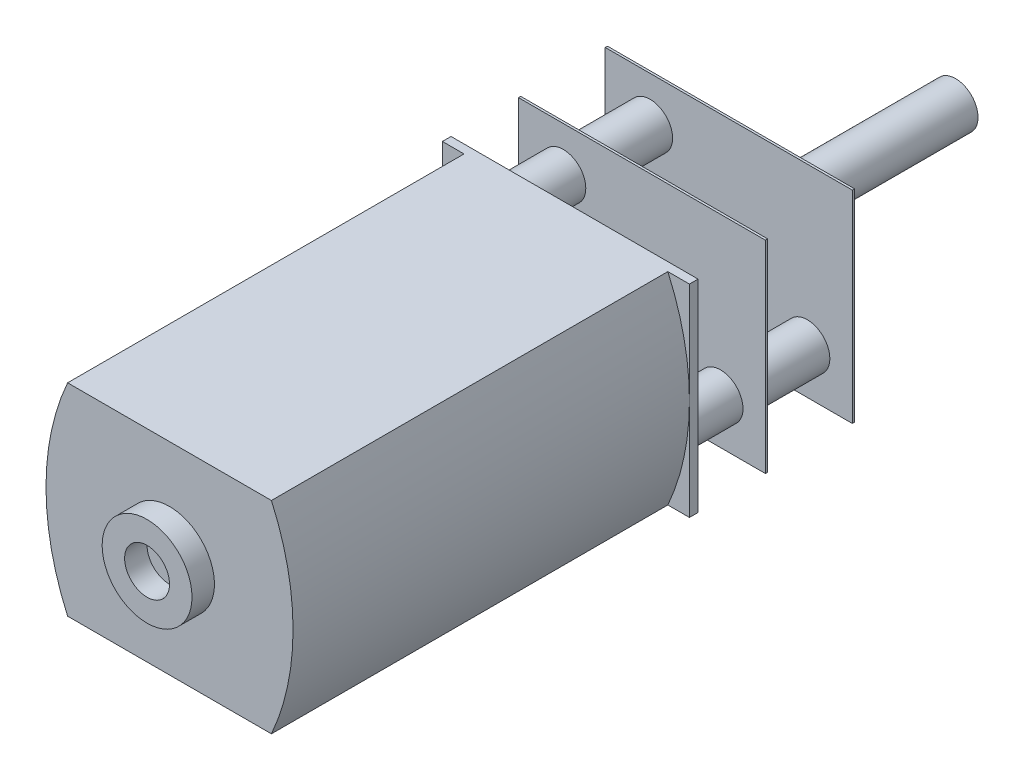
ISO-10303-21;
HEADER;
FILE_DESCRIPTION(('STEP AP214'),'2;1');
FILE_NAME('part.step','',(''),(''),'','','');
FILE_SCHEMA(('AUTOMOTIVE_DESIGN { 1 0 10303 214 1 1 1 1 }'));
ENDSEC;
DATA;
#1=APPLICATION_CONTEXT('core data for automotive mechanical design processes');
#2=APPLICATION_PROTOCOL_DEFINITION('international standard','automotive_design',2000,#1);
#3=PRODUCT_CONTEXT('',#1,'mechanical');
#4=PRODUCT('Part','Part','',(#3));
#5=PRODUCT_RELATED_PRODUCT_CATEGORY('part','',(#4));
#6=PRODUCT_DEFINITION_FORMATION('','',#4);
#7=PRODUCT_DEFINITION_CONTEXT('part definition',#1,'design');
#8=PRODUCT_DEFINITION('design','',#6,#7);
#9=PRODUCT_DEFINITION_SHAPE('','',#8);
#10=(LENGTH_UNIT() NAMED_UNIT(*) SI_UNIT(.MILLI.,.METRE.));
#11=(NAMED_UNIT(*) PLANE_ANGLE_UNIT() SI_UNIT($,.RADIAN.));
#12=(NAMED_UNIT(*) SI_UNIT($,.STERADIAN.) SOLID_ANGLE_UNIT());
#13=UNCERTAINTY_MEASURE_WITH_UNIT(LENGTH_MEASURE(1.E-05),#10,'distance_accuracy_value','');
#14=(GEOMETRIC_REPRESENTATION_CONTEXT(3) GLOBAL_UNCERTAINTY_ASSIGNED_CONTEXT((#13)) GLOBAL_UNIT_ASSIGNED_CONTEXT((#10,
#11,#12)) REPRESENTATION_CONTEXT('',''));
#15=CARTESIAN_POINT('',(0.,0.,0.));
#16=DIRECTION('',(0.,0.,1.));
#17=DIRECTION('',(1.,0.,0.));
#18=AXIS2_PLACEMENT_3D('',#15,#16,#17);
#19=CARTESIAN_POINT('',(2.,7.,-25.));
#20=DIRECTION('',(0.,0.,-1.));
#21=DIRECTION('',(-1.,0.,0.));
#22=AXIS2_PLACEMENT_3D('',#19,#20,#21);
#23=PLANE('',#22);
#24=DIRECTION('',(-1.,0.,0.));
#25=VECTOR('',#24,1.);
#26=CARTESIAN_POINT('',(0.,0.,-25.));
#27=LINE('',#26,#25);
#28=CARTESIAN_POINT('',(11.,0.,-25.));
#29=VERTEX_POINT('',#28);
#30=CARTESIAN_POINT('',(0.,0.,-25.));
#31=VERTEX_POINT('',#30);
#32=EDGE_CURVE('E242',#29,#31,#27,.T.);
#33=ORIENTED_EDGE('',*,*,#32,.T.);
#34=DIRECTION('',(0.,-1.,0.));
#35=VECTOR('',#34,1.);
#36=CARTESIAN_POINT('',(0.,9.,-25.));
#37=LINE('',#36,#35);
#38=CARTESIAN_POINT('',(0.,9.,-25.));
#39=VERTEX_POINT('',#38);
#40=EDGE_CURVE('E245',#39,#31,#37,.T.);
#41=ORIENTED_EDGE('',*,*,#40,.F.);
#42=DIRECTION('',(-1.,0.,0.));
#43=VECTOR('',#42,1.);
#44=CARTESIAN_POINT('',(0.,9.,-25.));
#45=LINE('',#44,#43);
#46=CARTESIAN_POINT('',(11.,9.,-25.));
#47=VERTEX_POINT('',#46);
#48=EDGE_CURVE('E238',#47,#39,#45,.T.);
#49=ORIENTED_EDGE('',*,*,#48,.F.);
#50=DIRECTION('',(0.,-1.,0.));
#51=VECTOR('',#50,1.);
#52=CARTESIAN_POINT('',(11.,9.,-25.));
#53=LINE('',#52,#51);
#54=EDGE_CURVE('E244',#47,#29,#53,.T.);
#55=ORIENTED_EDGE('',*,*,#54,.T.);
#56=EDGE_LOOP('',(#33,#41,#49,#55));
#57=FACE_BOUND('',#56,.T.);
#58=CARTESIAN_POINT('',(5.5,4.5,-25.));
#59=DIRECTION('',(0.,0.,-1.));
#60=DIRECTION('',(-1.,0.,0.));
#61=AXIS2_PLACEMENT_3D('',#58,#59,#60);
#62=CIRCLE('',#61,1.);
#63=CARTESIAN_POINT('',(4.5,4.5,-25.));
#64=VERTEX_POINT('',#63);
#65=EDGE_CURVE('E701',#64,#64,#62,.T.);
#66=ORIENTED_EDGE('',*,*,#65,.F.);
#67=EDGE_LOOP('',(#66));
#68=FACE_BOUND('',#67,.T.);
#69=ADVANCED_FACE('F70',(#57,#68),#23,.T.);
#70=CARTESIAN_POINT('',(0.,9.,0.));
#71=DIRECTION('',(0.,0.,-1.));
#72=DIRECTION('',(-1.,0.,0.));
#73=AXIS2_PLACEMENT_3D('',#70,#71,#72);
#74=PLANE('',#73);
#75=DIRECTION('',(1.,0.,0.));
#76=VECTOR('',#75,1.);
#77=CARTESIAN_POINT('',(0.,9.,0.));
#78=LINE('',#77,#76);
#79=CARTESIAN_POINT('',(0.962570050057635,9.,0.));
#80=VERTEX_POINT('',#79);
#81=CARTESIAN_POINT('',(10.0374299499424,9.,0.));
#82=VERTEX_POINT('',#81);
#83=EDGE_CURVE('E207',#80,#82,#78,.T.);
#84=ORIENTED_EDGE('',*,*,#83,.F.);
#85=CARTESIAN_POINT('',(11.,4.5,0.));
#86=DIRECTION('',(0.,0.,1.));
#87=DIRECTION('',(1.,0.,0.));
#88=AXIS2_PLACEMENT_3D('',#85,#86,#87);
#89=CIRCLE('',#88,11.);
#90=CARTESIAN_POINT('',(0.962570050057635,0.,0.));
#91=VERTEX_POINT('',#90);
#92=EDGE_CURVE('E189',#80,#91,#89,.T.);
#93=ORIENTED_EDGE('',*,*,#92,.T.);
#94=DIRECTION('',(1.,0.,0.));
#95=VECTOR('',#94,1.);
#96=CARTESIAN_POINT('',(0.,0.,0.));
#97=LINE('',#96,#95);
#98=CARTESIAN_POINT('',(10.0374299499424,0.,0.));
#99=VERTEX_POINT('',#98);
#100=EDGE_CURVE('E231',#91,#99,#97,.T.);
#101=ORIENTED_EDGE('',*,*,#100,.T.);
#102=CARTESIAN_POINT('',(0.,4.5,0.));
#103=DIRECTION('',(0.,0.,1.));
#104=DIRECTION('',(1.,0.,0.));
#105=AXIS2_PLACEMENT_3D('',#102,#103,#104);
#106=CIRCLE('',#105,11.);
#107=EDGE_CURVE('E218',#99,#82,#106,.T.);
#108=ORIENTED_EDGE('',*,*,#107,.T.);
#109=EDGE_LOOP('',(#84,#93,#101,#108));
#110=FACE_BOUND('',#109,.T.);
#111=CARTESIAN_POINT('',(5.5,4.5,0.));
#112=DIRECTION('',(0.,0.,-1.));
#113=DIRECTION('',(-1.,0.,0.));
#114=AXIS2_PLACEMENT_3D('',#111,#112,#113);
#115=CIRCLE('',#114,2.);
#116=CARTESIAN_POINT('',(3.5,4.5,0.));
#117=VERTEX_POINT('',#116);
#118=EDGE_CURVE('E12',#117,#117,#115,.F.);
#119=ORIENTED_EDGE('',*,*,#118,.F.);
#120=EDGE_LOOP('',(#119));
#121=FACE_BOUND('',#120,.T.);
#122=ADVANCED_FACE('F215',(#110,#121),#74,.F.);
#123=CARTESIAN_POINT('',(2.,7.,-15.2059029062643));
#124=DIRECTION('',(0.,0.,-1.));
#125=DIRECTION('',(-1.,0.,0.));
#126=AXIS2_PLACEMENT_3D('',#123,#124,#125);
#127=CYLINDRICAL_SURFACE('',#126,1.);
#128=CARTESIAN_POINT('',(2.,7.,-21.1343300310105));
#129=DIRECTION('',(0.,0.,1.));
#130=DIRECTION('',(1.,0.,0.));
#131=AXIS2_PLACEMENT_3D('',#128,#129,#130);
#132=CIRCLE('',#131,1.);
#133=CARTESIAN_POINT('',(3.,7.,-21.1343300310105));
#134=VERTEX_POINT('',#133);
#135=EDGE_CURVE('E276',#134,#134,#132,.T.);
#136=ORIENTED_EDGE('',*,*,#135,.F.);
#137=EDGE_LOOP('',(#136));
#138=FACE_BOUND('',#137,.T.);
#139=CARTESIAN_POINT('',(2.,7.,-24.9));
#140=DIRECTION('',(0.,0.,-1.));
#141=DIRECTION('',(-1.,0.,0.));
#142=AXIS2_PLACEMENT_3D('',#139,#140,#141);
#143=CIRCLE('',#142,1.);
#144=CARTESIAN_POINT('',(0.999999999999999,7.,-24.9));
#145=VERTEX_POINT('',#144);
#146=EDGE_CURVE('E255',#145,#145,#143,.F.);
#147=ORIENTED_EDGE('',*,*,#146,.T.);
#148=EDGE_LOOP('',(#147));
#149=FACE_BOUND('',#148,.T.);
#150=ADVANCED_FACE('F301',(#138,#149),#127,.T.);
#151=CARTESIAN_POINT('',(0.,0.,-21.0343300310105));
#152=DIRECTION('',(0.,0.,1.));
#153=DIRECTION('',(1.,0.,0.));
#154=AXIS2_PLACEMENT_3D('',#151,#152,#153);
#155=PLANE('',#154);
#156=CARTESIAN_POINT('',(9.,2.,-21.0343300310105));
#157=DIRECTION('',(0.,0.,1.));
#158=DIRECTION('',(1.,0.,0.));
#159=AXIS2_PLACEMENT_3D('',#156,#157,#158);
#160=CIRCLE('',#159,1.);
#161=CARTESIAN_POINT('',(10.,2.,-21.0343300310105));
#162=VERTEX_POINT('',#161);
#163=EDGE_CURVE('E78',#162,#162,#160,.T.);
#164=ORIENTED_EDGE('',*,*,#163,.F.);
#165=EDGE_LOOP('',(#164));
#166=FACE_BOUND('',#165,.T.);
#167=CARTESIAN_POINT('',(2.,7.,-21.0343300310105));
#168=DIRECTION('',(0.,0.,1.));
#169=DIRECTION('',(1.,0.,0.));
#170=AXIS2_PLACEMENT_3D('',#167,#168,#169);
#171=CIRCLE('',#170,1.);
#172=CARTESIAN_POINT('',(3.,7.,-21.0343300310105));
#173=VERTEX_POINT('',#172);
#174=EDGE_CURVE('E268',#173,#173,#171,.T.);
#175=ORIENTED_EDGE('',*,*,#174,.F.);
#176=EDGE_LOOP('',(#175));
#177=FACE_BOUND('',#176,.T.);
#178=DIRECTION('',(1.,0.,0.));
#179=VECTOR('',#178,1.);
#180=CARTESIAN_POINT('',(0.,9.,-21.0343300310105));
#181=LINE('',#180,#179);
#182=CARTESIAN_POINT('',(0.,9.,-21.0343300310105));
#183=VERTEX_POINT('',#182);
#184=CARTESIAN_POINT('',(11.,9.,-21.0343300310105));
#185=VERTEX_POINT('',#184);
#186=EDGE_CURVE('E285',#183,#185,#181,.T.);
#187=ORIENTED_EDGE('',*,*,#186,.F.);
#188=DIRECTION('',(0.,1.,0.));
#189=VECTOR('',#188,1.);
#190=CARTESIAN_POINT('',(0.,0.,-21.0343300310105));
#191=LINE('',#190,#189);
#192=CARTESIAN_POINT('',(0.,0.,-21.0343300310105));
#193=VERTEX_POINT('',#192);
#194=EDGE_CURVE('E278',#193,#183,#191,.T.);
#195=ORIENTED_EDGE('',*,*,#194,.F.);
#196=DIRECTION('',(1.,0.,0.));
#197=VECTOR('',#196,1.);
#198=CARTESIAN_POINT('',(0.,0.,-21.0343300310105));
#199=LINE('',#198,#197);
#200=CARTESIAN_POINT('',(11.,0.,-21.0343300310105));
#201=VERTEX_POINT('',#200);
#202=EDGE_CURVE('E281',#193,#201,#199,.T.);
#203=ORIENTED_EDGE('',*,*,#202,.T.);
#204=DIRECTION('',(0.,1.,0.));
#205=VECTOR('',#204,1.);
#206=CARTESIAN_POINT('',(11.,0.,-21.0343300310105));
#207=LINE('',#206,#205);
#208=EDGE_CURVE('E94',#201,#185,#207,.T.);
#209=ORIENTED_EDGE('',*,*,#208,.T.);
#210=EDGE_LOOP('',(#187,#195,#203,#209));
#211=FACE_BOUND('',#210,.T.);
#212=ADVANCED_FACE('F353',(#166,#177,#211),#155,.T.);
#213=CARTESIAN_POINT('',(0.,9.,0.));
#214=DIRECTION('',(0.,-1.,0.));
#215=DIRECTION('',(0.,0.,-1.));
#216=AXIS2_PLACEMENT_3D('',#213,#214,#215);
#217=PLANE('',#216);
#218=DIRECTION('',(0.,0.,-1.));
#219=VECTOR('',#218,1.);
#220=CARTESIAN_POINT('',(11.,9.,0.));
#221=LINE('',#220,#219);
#222=CARTESIAN_POINT('',(11.,9.,-21.1343300310105));
#223=VERTEX_POINT('',#222);
#224=EDGE_CURVE('E287',#185,#223,#221,.T.);
#225=ORIENTED_EDGE('',*,*,#224,.T.);
#226=DIRECTION('',(1.,0.,0.));
#227=VECTOR('',#226,1.);
#228=CARTESIAN_POINT('',(0.,9.,-21.1343300310105));
#229=LINE('',#228,#227);
#230=CARTESIAN_POINT('',(0.,9.,-21.1343300310105));
#231=VERTEX_POINT('',#230);
#232=EDGE_CURVE('E274',#231,#223,#229,.T.);
#233=ORIENTED_EDGE('',*,*,#232,.F.);
#234=DIRECTION('',(0.,0.,1.));
#235=VECTOR('',#234,1.);
#236=CARTESIAN_POINT('',(0.,9.,0.));
#237=LINE('',#236,#235);
#238=EDGE_CURVE('E290',#231,#183,#237,.T.);
#239=ORIENTED_EDGE('',*,*,#238,.T.);
#240=ORIENTED_EDGE('',*,*,#186,.T.);
#241=EDGE_LOOP('',(#225,#233,#239,#240));
#242=FACE_BOUND('',#241,.T.);
#243=ADVANCED_FACE('F356',(#242),#217,.F.);
#244=CARTESIAN_POINT('',(0.,0.,0.));
#245=DIRECTION('',(0.,-1.,0.));
#246=DIRECTION('',(0.,0.,-1.));
#247=AXIS2_PLACEMENT_3D('',#244,#245,#246);
#248=PLANE('',#247);
#249=DIRECTION('',(1.,0.,0.));
#250=VECTOR('',#249,1.);
#251=CARTESIAN_POINT('',(0.,0.,-21.1343300310105));
#252=LINE('',#251,#250);
#253=CARTESIAN_POINT('',(0.,0.,-21.1343300310105));
#254=VERTEX_POINT('',#253);
#255=CARTESIAN_POINT('',(11.,0.,-21.1343300310105));
#256=VERTEX_POINT('',#255);
#257=EDGE_CURVE('E271',#254,#256,#252,.T.);
#258=ORIENTED_EDGE('',*,*,#257,.T.);
#259=DIRECTION('',(0.,0.,-1.));
#260=VECTOR('',#259,1.);
#261=CARTESIAN_POINT('',(11.,0.,0.));
#262=LINE('',#261,#260);
#263=EDGE_CURVE('E288',#201,#256,#262,.T.);
#264=ORIENTED_EDGE('',*,*,#263,.F.);
#265=ORIENTED_EDGE('',*,*,#202,.F.);
#266=DIRECTION('',(0.,0.,1.));
#267=VECTOR('',#266,1.);
#268=CARTESIAN_POINT('',(0.,0.,0.));
#269=LINE('',#268,#267);
#270=EDGE_CURVE('E284',#254,#193,#269,.T.);
#271=ORIENTED_EDGE('',*,*,#270,.F.);
#272=EDGE_LOOP('',(#258,#264,#265,#271));
#273=FACE_BOUND('',#272,.T.);
#274=ADVANCED_FACE('F360',(#273),#248,.T.);
#275=CARTESIAN_POINT('',(11.,9.,0.));
#276=DIRECTION('',(-1.,0.,0.));
#277=DIRECTION('',(0.,0.,1.));
#278=AXIS2_PLACEMENT_3D('',#275,#276,#277);
#279=PLANE('',#278);
#280=ORIENTED_EDGE('',*,*,#263,.T.);
#281=DIRECTION('',(0.,1.,0.));
#282=VECTOR('',#281,1.);
#283=CARTESIAN_POINT('',(11.,0.,-21.1343300310105));
#284=LINE('',#283,#282);
#285=EDGE_CURVE('E85',#256,#223,#284,.T.);
#286=ORIENTED_EDGE('',*,*,#285,.T.);
#287=ORIENTED_EDGE('',*,*,#224,.F.);
#288=ORIENTED_EDGE('',*,*,#208,.F.);
#289=EDGE_LOOP('',(#280,#286,#287,#288));
#290=FACE_BOUND('',#289,.T.);
#291=ADVANCED_FACE('F363',(#290),#279,.F.);
#292=CARTESIAN_POINT('',(0.,9.,0.));
#293=DIRECTION('',(1.,0.,0.));
#294=DIRECTION('',(0.,0.,-1.));
#295=AXIS2_PLACEMENT_3D('',#292,#293,#294);
#296=PLANE('',#295);
#297=ORIENTED_EDGE('',*,*,#238,.F.);
#298=DIRECTION('',(0.,1.,0.));
#299=VECTOR('',#298,1.);
#300=CARTESIAN_POINT('',(0.,0.,-21.1343300310105));
#301=LINE('',#300,#299);
#302=EDGE_CURVE('E273',#254,#231,#301,.T.);
#303=ORIENTED_EDGE('',*,*,#302,.F.);
#304=ORIENTED_EDGE('',*,*,#270,.T.);
#305=ORIENTED_EDGE('',*,*,#194,.T.);
#306=EDGE_LOOP('',(#297,#303,#304,#305));
#307=FACE_BOUND('',#306,.T.);
#308=ADVANCED_FACE('F72',(#307),#296,.F.);
#309=CARTESIAN_POINT('',(0.,0.,-21.1343300310105));
#310=DIRECTION('',(0.,0.,1.));
#311=DIRECTION('',(1.,0.,0.));
#312=AXIS2_PLACEMENT_3D('',#309,#310,#311);
#313=PLANE('',#312);
#314=CARTESIAN_POINT('',(9.,2.,-21.1343300310105));
#315=DIRECTION('',(0.,0.,1.));
#316=DIRECTION('',(1.,0.,0.));
#317=AXIS2_PLACEMENT_3D('',#314,#315,#316);
#318=CIRCLE('',#317,1.);
#319=CARTESIAN_POINT('',(10.,2.,-21.1343300310105));
#320=VERTEX_POINT('',#319);
#321=EDGE_CURVE('E212',#320,#320,#318,.T.);
#322=ORIENTED_EDGE('',*,*,#321,.T.);
#323=EDGE_LOOP('',(#322));
#324=FACE_BOUND('',#323,.T.);
#325=ORIENTED_EDGE('',*,*,#135,.T.);
#326=EDGE_LOOP('',(#325));
#327=FACE_BOUND('',#326,.T.);
#328=ORIENTED_EDGE('',*,*,#232,.T.);
#329=ORIENTED_EDGE('',*,*,#285,.F.);
#330=ORIENTED_EDGE('',*,*,#257,.F.);
#331=ORIENTED_EDGE('',*,*,#302,.T.);
#332=EDGE_LOOP('',(#328,#329,#330,#331));
#333=FACE_BOUND('',#332,.T.);
#334=ADVANCED_FACE('F348',(#324,#327,#333),#313,.F.);
#335=ORIENTED_EDGE('',*,*,#174,.T.);
#336=EDGE_LOOP('',(#335));
#337=FACE_BOUND('',#336,.T.);
#338=CARTESIAN_POINT('',(2.,7.,-18.0343300310105));
#339=DIRECTION('',(0.,0.,1.));
#340=DIRECTION('',(1.,0.,0.));
#341=AXIS2_PLACEMENT_3D('',#338,#339,#340);
#342=CIRCLE('',#341,1.);
#343=CARTESIAN_POINT('',(3.,7.,-18.0343300310105));
#344=VERTEX_POINT('',#343);
#345=EDGE_CURVE('E222',#344,#344,#342,.F.);
#346=ORIENTED_EDGE('',*,*,#345,.T.);
#347=EDGE_LOOP('',(#346));
#348=FACE_BOUND('',#347,.T.);
#349=ADVANCED_FACE('F335',(#337,#348),#127,.T.);
#350=CARTESIAN_POINT('',(0.,9.,0.));
#351=DIRECTION('',(1.,0.,0.));
#352=DIRECTION('',(0.,0.,-1.));
#353=AXIS2_PLACEMENT_3D('',#350,#351,#352);
#354=PLANE('',#353);
#355=DIRECTION('',(0.,0.,1.));
#356=VECTOR('',#355,1.);
#357=CARTESIAN_POINT('',(0.,0.,0.));
#358=LINE('',#357,#356);
#359=CARTESIAN_POINT('',(0.,0.,-24.9));
#360=VERTEX_POINT('',#359);
#361=EDGE_CURVE('E237',#31,#360,#358,.T.);
#362=ORIENTED_EDGE('',*,*,#361,.T.);
#363=DIRECTION('',(0.,1.,0.));
#364=VECTOR('',#363,1.);
#365=CARTESIAN_POINT('',(0.,0.,-24.9));
#366=LINE('',#365,#364);
#367=CARTESIAN_POINT('',(0.,9.,-24.9));
#368=VERTEX_POINT('',#367);
#369=EDGE_CURVE('E249',#360,#368,#366,.T.);
#370=ORIENTED_EDGE('',*,*,#369,.T.);
#371=DIRECTION('',(0.,0.,1.));
#372=VECTOR('',#371,1.);
#373=CARTESIAN_POINT('',(0.,9.,0.));
#374=LINE('',#373,#372);
#375=EDGE_CURVE('E261',#39,#368,#374,.T.);
#376=ORIENTED_EDGE('',*,*,#375,.F.);
#377=ORIENTED_EDGE('',*,*,#40,.T.);
#378=EDGE_LOOP('',(#362,#370,#376,#377));
#379=FACE_BOUND('',#378,.T.);
#380=ADVANCED_FACE('F315',(#379),#354,.F.);
#381=CARTESIAN_POINT('',(11.,9.,0.));
#382=DIRECTION('',(-1.,0.,0.));
#383=DIRECTION('',(0.,0.,1.));
#384=AXIS2_PLACEMENT_3D('',#381,#382,#383);
#385=PLANE('',#384);
#386=DIRECTION('',(0.,0.,-1.));
#387=VECTOR('',#386,1.);
#388=CARTESIAN_POINT('',(11.,9.,0.));
#389=LINE('',#388,#387);
#390=CARTESIAN_POINT('',(11.,9.,-24.9));
#391=VERTEX_POINT('',#390);
#392=EDGE_CURVE('E241',#391,#47,#389,.T.);
#393=ORIENTED_EDGE('',*,*,#392,.F.);
#394=DIRECTION('',(0.,1.,0.));
#395=VECTOR('',#394,1.);
#396=CARTESIAN_POINT('',(11.,0.,-24.9));
#397=LINE('',#396,#395);
#398=CARTESIAN_POINT('',(11.,0.,-24.9));
#399=VERTEX_POINT('',#398);
#400=EDGE_CURVE('E253',#399,#391,#397,.T.);
#401=ORIENTED_EDGE('',*,*,#400,.F.);
#402=DIRECTION('',(0.,0.,-1.));
#403=VECTOR('',#402,1.);
#404=CARTESIAN_POINT('',(11.,0.,0.));
#405=LINE('',#404,#403);
#406=EDGE_CURVE('E248',#399,#29,#405,.T.);
#407=ORIENTED_EDGE('',*,*,#406,.T.);
#408=ORIENTED_EDGE('',*,*,#54,.F.);
#409=EDGE_LOOP('',(#393,#401,#407,#408));
#410=FACE_BOUND('',#409,.T.);
#411=ADVANCED_FACE('F327',(#410),#385,.F.);
#412=CARTESIAN_POINT('',(0.,9.,0.));
#413=DIRECTION('',(0.,-1.,0.));
#414=DIRECTION('',(0.,0.,-1.));
#415=AXIS2_PLACEMENT_3D('',#412,#413,#414);
#416=PLANE('',#415);
#417=ORIENTED_EDGE('',*,*,#375,.T.);
#418=DIRECTION('',(-1.,0.,0.));
#419=VECTOR('',#418,1.);
#420=CARTESIAN_POINT('',(0.,9.,-24.9));
#421=LINE('',#420,#419);
#422=EDGE_CURVE('E252',#391,#368,#421,.T.);
#423=ORIENTED_EDGE('',*,*,#422,.F.);
#424=ORIENTED_EDGE('',*,*,#392,.T.);
#425=ORIENTED_EDGE('',*,*,#48,.T.);
#426=EDGE_LOOP('',(#417,#423,#424,#425));
#427=FACE_BOUND('',#426,.T.);
#428=ADVANCED_FACE('F317',(#427),#416,.F.);
#429=CARTESIAN_POINT('',(0.,0.,0.));
#430=DIRECTION('',(0.,-1.,0.));
#431=DIRECTION('',(0.,0.,-1.));
#432=AXIS2_PLACEMENT_3D('',#429,#430,#431);
#433=PLANE('',#432);
#434=DIRECTION('',(-1.,0.,0.));
#435=VECTOR('',#434,1.);
#436=CARTESIAN_POINT('',(0.,0.,-24.9));
#437=LINE('',#436,#435);
#438=EDGE_CURVE('E240',#399,#360,#437,.T.);
#439=ORIENTED_EDGE('',*,*,#438,.T.);
#440=ORIENTED_EDGE('',*,*,#361,.F.);
#441=ORIENTED_EDGE('',*,*,#32,.F.);
#442=ORIENTED_EDGE('',*,*,#406,.F.);
#443=EDGE_LOOP('',(#439,#440,#441,#442));
#444=FACE_BOUND('',#443,.T.);
#445=ADVANCED_FACE('F306',(#444),#433,.T.);
#446=CARTESIAN_POINT('',(0.,0.,-24.9));
#447=DIRECTION('',(0.,0.,-1.));
#448=DIRECTION('',(-1.,0.,0.));
#449=AXIS2_PLACEMENT_3D('',#446,#447,#448);
#450=PLANE('',#449);
#451=CARTESIAN_POINT('',(9.,2.,-24.9));
#452=DIRECTION('',(0.,0.,-1.));
#453=DIRECTION('',(-1.,0.,0.));
#454=AXIS2_PLACEMENT_3D('',#451,#452,#453);
#455=CIRCLE('',#454,1.);
#456=CARTESIAN_POINT('',(8.,2.,-24.9));
#457=VERTEX_POINT('',#456);
#458=EDGE_CURVE('E717',#457,#457,#455,.T.);
#459=ORIENTED_EDGE('',*,*,#458,.T.);
#460=EDGE_LOOP('',(#459));
#461=FACE_BOUND('',#460,.T.);
#462=ORIENTED_EDGE('',*,*,#146,.F.);
#463=EDGE_LOOP('',(#462));
#464=FACE_BOUND('',#463,.T.);
#465=ORIENTED_EDGE('',*,*,#422,.T.);
#466=ORIENTED_EDGE('',*,*,#369,.F.);
#467=ORIENTED_EDGE('',*,*,#438,.F.);
#468=ORIENTED_EDGE('',*,*,#400,.T.);
#469=EDGE_LOOP('',(#465,#466,#467,#468));
#470=FACE_BOUND('',#469,.T.);
#471=ADVANCED_FACE('F303',(#461,#464,#470),#450,.F.);
#472=CARTESIAN_POINT('',(0.,9.,0.));
#473=DIRECTION('',(0.,-1.,0.));
#474=DIRECTION('',(0.,0.,-1.));
#475=AXIS2_PLACEMENT_3D('',#472,#473,#474);
#476=PLANE('',#475);
#477=DIRECTION('',(0.,0.,1.));
#478=VECTOR('',#477,1.);
#479=CARTESIAN_POINT('',(0.962570050057635,9.,-17.65));
#480=LINE('',#479,#478);
#481=CARTESIAN_POINT('',(0.962570050057635,9.,-17.65));
#482=VERTEX_POINT('',#481);
#483=EDGE_CURVE('E193',#482,#80,#480,.T.);
#484=ORIENTED_EDGE('',*,*,#483,.T.);
#485=ORIENTED_EDGE('',*,*,#83,.T.);
#486=DIRECTION('',(0.,0.,1.));
#487=VECTOR('',#486,1.);
#488=CARTESIAN_POINT('',(10.0374299499424,9.,-17.65));
#489=LINE('',#488,#487);
#490=CARTESIAN_POINT('',(10.0374299499424,9.,-17.65));
#491=VERTEX_POINT('',#490);
#492=EDGE_CURVE('E750',#491,#82,#489,.T.);
#493=ORIENTED_EDGE('',*,*,#492,.F.);
#494=DIRECTION('',(-1.,0.,0.));
#495=VECTOR('',#494,1.);
#496=CARTESIAN_POINT('',(0.,9.,-17.65));
#497=LINE('',#496,#495);
#498=CARTESIAN_POINT('',(11.,9.,-17.65));
#499=VERTEX_POINT('',#498);
#500=EDGE_CURVE('E747',#499,#491,#497,.T.);
#501=ORIENTED_EDGE('',*,*,#500,.F.);
#502=DIRECTION('',(0.,0.,-1.));
#503=VECTOR('',#502,1.);
#504=CARTESIAN_POINT('',(11.,9.,0.));
#505=LINE('',#504,#503);
#506=CARTESIAN_POINT('',(11.,9.,-18.0343300310105));
#507=VERTEX_POINT('',#506);
#508=EDGE_CURVE('E219',#499,#507,#505,.T.);
#509=ORIENTED_EDGE('',*,*,#508,.T.);
#510=DIRECTION('',(1.,0.,0.));
#511=VECTOR('',#510,1.);
#512=CARTESIAN_POINT('',(0.,9.,-18.0343300310105));
#513=LINE('',#512,#511);
#514=CARTESIAN_POINT('',(0.,9.,-18.0343300310105));
#515=VERTEX_POINT('',#514);
#516=EDGE_CURVE('E753',#515,#507,#513,.T.);
#517=ORIENTED_EDGE('',*,*,#516,.F.);
#518=DIRECTION('',(0.,0.,1.));
#519=VECTOR('',#518,1.);
#520=CARTESIAN_POINT('',(0.,9.,0.));
#521=LINE('',#520,#519);
#522=CARTESIAN_POINT('',(0.,9.,-17.65));
#523=VERTEX_POINT('',#522);
#524=EDGE_CURVE('E220',#515,#523,#521,.T.);
#525=ORIENTED_EDGE('',*,*,#524,.T.);
#526=DIRECTION('',(-1.,0.,0.));
#527=VECTOR('',#526,1.);
#528=CARTESIAN_POINT('',(0.,9.,-17.65));
#529=LINE('',#528,#527);
#530=EDGE_CURVE('E210',#482,#523,#529,.T.);
#531=ORIENTED_EDGE('',*,*,#530,.F.);
#532=EDGE_LOOP('',(#484,#485,#493,#501,#509,#517,#525,#531));
#533=FACE_BOUND('',#532,.T.);
#534=ADVANCED_FACE('F205',(#533),#476,.F.);
#535=CARTESIAN_POINT('',(0.,9.,0.));
#536=DIRECTION('',(1.,0.,0.));
#537=DIRECTION('',(0.,0.,-1.));
#538=AXIS2_PLACEMENT_3D('',#535,#536,#537);
#539=PLANE('',#538);
#540=DIRECTION('',(0.,-1.,0.));
#541=VECTOR('',#540,1.);
#542=CARTESIAN_POINT('',(0.,0.,-17.65));
#543=LINE('',#542,#541);
#544=CARTESIAN_POINT('',(0.,4.5,-17.65));
#545=VERTEX_POINT('',#544);
#546=EDGE_CURVE('E211',#523,#545,#543,.T.);
#547=ORIENTED_EDGE('',*,*,#546,.F.);
#548=ORIENTED_EDGE('',*,*,#524,.F.);
#549=DIRECTION('',(0.,1.,0.));
#550=VECTOR('',#549,1.);
#551=CARTESIAN_POINT('',(0.,0.,-18.0343300310105));
#552=LINE('',#551,#550);
#553=CARTESIAN_POINT('',(0.,0.,-18.0343300310105));
#554=VERTEX_POINT('',#553);
#555=EDGE_CURVE('E757',#554,#515,#552,.T.);
#556=ORIENTED_EDGE('',*,*,#555,.F.);
#557=DIRECTION('',(0.,0.,1.));
#558=VECTOR('',#557,1.);
#559=CARTESIAN_POINT('',(0.,0.,0.));
#560=LINE('',#559,#558);
#561=CARTESIAN_POINT('',(0.,0.,-17.65));
#562=VERTEX_POINT('',#561);
#563=EDGE_CURVE('E228',#554,#562,#560,.T.);
#564=ORIENTED_EDGE('',*,*,#563,.T.);
#565=DIRECTION('',(0.,-1.,0.));
#566=VECTOR('',#565,1.);
#567=CARTESIAN_POINT('',(0.,0.,-17.65));
#568=LINE('',#567,#566);
#569=EDGE_CURVE('E727',#545,#562,#568,.T.);
#570=ORIENTED_EDGE('',*,*,#569,.F.);
#571=EDGE_LOOP('',(#547,#548,#556,#564,#570));
#572=FACE_BOUND('',#571,.T.);
#573=ADVANCED_FACE('F516',(#572),#539,.F.);
#574=CARTESIAN_POINT('',(0.,0.,0.));
#575=DIRECTION('',(0.,-1.,0.));
#576=DIRECTION('',(0.,0.,-1.));
#577=AXIS2_PLACEMENT_3D('',#574,#575,#576);
#578=PLANE('',#577);
#579=ORIENTED_EDGE('',*,*,#100,.F.);
#580=DIRECTION('',(0.,0.,1.));
#581=VECTOR('',#580,1.);
#582=CARTESIAN_POINT('',(0.962570050057635,0.,-17.65));
#583=LINE('',#582,#581);
#584=CARTESIAN_POINT('',(0.962570050057635,0.,-17.65));
#585=VERTEX_POINT('',#584);
#586=EDGE_CURVE('E196',#585,#91,#583,.T.);
#587=ORIENTED_EDGE('',*,*,#586,.F.);
#588=DIRECTION('',(1.,0.,0.));
#589=VECTOR('',#588,1.);
#590=CARTESIAN_POINT('',(0.,0.,-17.65));
#591=LINE('',#590,#589);
#592=EDGE_CURVE('E729',#562,#585,#591,.T.);
#593=ORIENTED_EDGE('',*,*,#592,.F.);
#594=ORIENTED_EDGE('',*,*,#563,.F.);
#595=DIRECTION('',(1.,0.,0.));
#596=VECTOR('',#595,1.);
#597=CARTESIAN_POINT('',(0.,0.,-18.0343300310105));
#598=LINE('',#597,#596);
#599=CARTESIAN_POINT('',(11.,0.,-18.0343300310105));
#600=VERTEX_POINT('',#599);
#601=EDGE_CURVE('E754',#554,#600,#598,.T.);
#602=ORIENTED_EDGE('',*,*,#601,.T.);
#603=DIRECTION('',(0.,0.,-1.));
#604=VECTOR('',#603,1.);
#605=CARTESIAN_POINT('',(11.,0.,0.));
#606=LINE('',#605,#604);
#607=CARTESIAN_POINT('',(11.,0.,-17.65));
#608=VERTEX_POINT('',#607);
#609=EDGE_CURVE('E224',#608,#600,#606,.T.);
#610=ORIENTED_EDGE('',*,*,#609,.F.);
#611=DIRECTION('',(1.,0.,0.));
#612=VECTOR('',#611,1.);
#613=CARTESIAN_POINT('',(0.,0.,-17.65));
#614=LINE('',#613,#612);
#615=CARTESIAN_POINT('',(10.0374299499424,0.,-17.65));
#616=VERTEX_POINT('',#615);
#617=EDGE_CURVE('E738',#616,#608,#614,.T.);
#618=ORIENTED_EDGE('',*,*,#617,.F.);
#619=DIRECTION('',(0.,0.,1.));
#620=VECTOR('',#619,1.);
#621=CARTESIAN_POINT('',(10.0374299499424,0.,-17.65));
#622=LINE('',#621,#620);
#623=EDGE_CURVE('E733',#616,#99,#622,.T.);
#624=ORIENTED_EDGE('',*,*,#623,.T.);
#625=EDGE_LOOP('',(#579,#587,#593,#594,#602,#610,#618,#624));
#626=FACE_BOUND('',#625,.T.);
#627=ADVANCED_FACE('F506',(#626),#578,.T.);
#628=CARTESIAN_POINT('',(11.,9.,0.));
#629=DIRECTION('',(-1.,0.,0.));
#630=DIRECTION('',(0.,0.,1.));
#631=AXIS2_PLACEMENT_3D('',#628,#629,#630);
#632=PLANE('',#631);
#633=DIRECTION('',(0.,1.,0.));
#634=VECTOR('',#633,1.);
#635=CARTESIAN_POINT('',(11.,0.,-17.65));
#636=LINE('',#635,#634);
#637=CARTESIAN_POINT('',(11.,4.5,-17.65));
#638=VERTEX_POINT('',#637);
#639=EDGE_CURVE('E736',#608,#638,#636,.T.);
#640=ORIENTED_EDGE('',*,*,#639,.F.);
#641=ORIENTED_EDGE('',*,*,#609,.T.);
#642=DIRECTION('',(0.,1.,0.));
#643=VECTOR('',#642,1.);
#644=CARTESIAN_POINT('',(11.,0.,-18.0343300310105));
#645=LINE('',#644,#643);
#646=EDGE_CURVE('E232',#600,#507,#645,.T.);
#647=ORIENTED_EDGE('',*,*,#646,.T.);
#648=ORIENTED_EDGE('',*,*,#508,.F.);
#649=DIRECTION('',(0.,1.,0.));
#650=VECTOR('',#649,1.);
#651=CARTESIAN_POINT('',(11.,0.,-17.65));
#652=LINE('',#651,#650);
#653=EDGE_CURVE('E745',#638,#499,#652,.T.);
#654=ORIENTED_EDGE('',*,*,#653,.F.);
#655=EDGE_LOOP('',(#640,#641,#647,#648,#654));
#656=FACE_BOUND('',#655,.T.);
#657=ADVANCED_FACE('F497',(#656),#632,.F.);
#658=CARTESIAN_POINT('',(0.,0.,-18.0343300310105));
#659=DIRECTION('',(0.,0.,1.));
#660=DIRECTION('',(1.,0.,0.));
#661=AXIS2_PLACEMENT_3D('',#658,#659,#660);
#662=PLANE('',#661);
#663=CARTESIAN_POINT('',(9.,2.,-18.0343300310105));
#664=DIRECTION('',(0.,0.,1.));
#665=DIRECTION('',(1.,0.,0.));
#666=AXIS2_PLACEMENT_3D('',#663,#664,#665);
#667=CIRCLE('',#666,1.);
#668=CARTESIAN_POINT('',(10.,2.,-18.0343300310105));
#669=VERTEX_POINT('',#668);
#670=EDGE_CURVE('E714',#669,#669,#667,.F.);
#671=ORIENTED_EDGE('',*,*,#670,.F.);
#672=EDGE_LOOP('',(#671));
#673=FACE_BOUND('',#672,.T.);
#674=ORIENTED_EDGE('',*,*,#345,.F.);
#675=EDGE_LOOP('',(#674));
#676=FACE_BOUND('',#675,.T.);
#677=ORIENTED_EDGE('',*,*,#516,.T.);
#678=ORIENTED_EDGE('',*,*,#646,.F.);
#679=ORIENTED_EDGE('',*,*,#601,.F.);
#680=ORIENTED_EDGE('',*,*,#555,.T.);
#681=EDGE_LOOP('',(#677,#678,#679,#680));
#682=FACE_BOUND('',#681,.T.);
#683=ADVANCED_FACE('F485',(#673,#676,#682),#662,.F.);
#684=CARTESIAN_POINT('',(0.,4.5,-17.65));
#685=DIRECTION('',(0.,0.,1.));
#686=DIRECTION('',(1.,0.,0.));
#687=AXIS2_PLACEMENT_3D('',#684,#685,#686);
#688=CYLINDRICAL_SURFACE('',#687,11.);
#689=ORIENTED_EDGE('',*,*,#107,.F.);
#690=ORIENTED_EDGE('',*,*,#623,.F.);
#691=CARTESIAN_POINT('',(0.,4.5,-17.65));
#692=DIRECTION('',(0.,0.,1.));
#693=DIRECTION('',(1.,0.,0.));
#694=AXIS2_PLACEMENT_3D('',#691,#692,#693);
#695=CIRCLE('',#694,11.);
#696=EDGE_CURVE('E740',#616,#638,#695,.T.);
#697=ORIENTED_EDGE('',*,*,#696,.T.);
#698=CARTESIAN_POINT('',(0.,4.5,-17.65));
#699=DIRECTION('',(0.,0.,1.));
#700=DIRECTION('',(1.,0.,0.));
#701=AXIS2_PLACEMENT_3D('',#698,#699,#700);
#702=CIRCLE('',#701,11.);
#703=EDGE_CURVE('E743',#638,#491,#702,.T.);
#704=ORIENTED_EDGE('',*,*,#703,.T.);
#705=ORIENTED_EDGE('',*,*,#492,.T.);
#706=EDGE_LOOP('',(#689,#690,#697,#704,#705));
#707=FACE_BOUND('',#706,.T.);
#708=ADVANCED_FACE('F427',(#707),#688,.T.);
#709=CARTESIAN_POINT('',(0.,0.,-17.65));
#710=DIRECTION('',(0.,0.,1.));
#711=DIRECTION('',(1.,0.,0.));
#712=AXIS2_PLACEMENT_3D('',#709,#710,#711);
#713=PLANE('',#712);
#714=ORIENTED_EDGE('',*,*,#703,.F.);
#715=ORIENTED_EDGE('',*,*,#653,.T.);
#716=ORIENTED_EDGE('',*,*,#500,.T.);
#717=EDGE_LOOP('',(#714,#715,#716));
#718=FACE_BOUND('',#717,.T.);
#719=ADVANCED_FACE('F421',(#718),#713,.T.);
#720=CARTESIAN_POINT('',(0.,0.,-17.65));
#721=DIRECTION('',(0.,0.,1.));
#722=DIRECTION('',(1.,0.,0.));
#723=AXIS2_PLACEMENT_3D('',#720,#721,#722);
#724=PLANE('',#723);
#725=ORIENTED_EDGE('',*,*,#696,.F.);
#726=ORIENTED_EDGE('',*,*,#617,.T.);
#727=ORIENTED_EDGE('',*,*,#639,.T.);
#728=EDGE_LOOP('',(#725,#726,#727));
#729=FACE_BOUND('',#728,.T.);
#730=ADVANCED_FACE('F426',(#729),#724,.T.);
#731=CARTESIAN_POINT('',(11.,4.5,-17.65));
#732=DIRECTION('',(0.,0.,1.));
#733=DIRECTION('',(1.,0.,0.));
#734=AXIS2_PLACEMENT_3D('',#731,#732,#733);
#735=CYLINDRICAL_SURFACE('',#734,11.);
#736=ORIENTED_EDGE('',*,*,#92,.F.);
#737=ORIENTED_EDGE('',*,*,#483,.F.);
#738=CARTESIAN_POINT('',(11.,4.5,-17.65));
#739=DIRECTION('',(0.,0.,1.));
#740=DIRECTION('',(1.,0.,0.));
#741=AXIS2_PLACEMENT_3D('',#738,#739,#740);
#742=CIRCLE('',#741,11.);
#743=EDGE_CURVE('E201',#482,#545,#742,.T.);
#744=ORIENTED_EDGE('',*,*,#743,.T.);
#745=CARTESIAN_POINT('',(11.,4.5,-17.65));
#746=DIRECTION('',(0.,0.,1.));
#747=DIRECTION('',(1.,0.,0.));
#748=AXIS2_PLACEMENT_3D('',#745,#746,#747);
#749=CIRCLE('',#748,11.);
#750=EDGE_CURVE('E200',#545,#585,#749,.T.);
#751=ORIENTED_EDGE('',*,*,#750,.T.);
#752=ORIENTED_EDGE('',*,*,#586,.T.);
#753=EDGE_LOOP('',(#736,#737,#744,#751,#752));
#754=FACE_BOUND('',#753,.T.);
#755=ADVANCED_FACE('F191',(#754),#735,.T.);
#756=CARTESIAN_POINT('',(0.,0.,-17.65));
#757=DIRECTION('',(0.,0.,1.));
#758=DIRECTION('',(1.,0.,0.));
#759=AXIS2_PLACEMENT_3D('',#756,#757,#758);
#760=PLANE('',#759);
#761=ORIENTED_EDGE('',*,*,#750,.F.);
#762=ORIENTED_EDGE('',*,*,#569,.T.);
#763=ORIENTED_EDGE('',*,*,#592,.T.);
#764=EDGE_LOOP('',(#761,#762,#763));
#765=FACE_BOUND('',#764,.T.);
#766=ADVANCED_FACE('F452',(#765),#760,.T.);
#767=CARTESIAN_POINT('',(0.,0.,-17.65));
#768=DIRECTION('',(0.,0.,1.));
#769=DIRECTION('',(1.,0.,0.));
#770=AXIS2_PLACEMENT_3D('',#767,#768,#769);
#771=PLANE('',#770);
#772=ORIENTED_EDGE('',*,*,#743,.F.);
#773=ORIENTED_EDGE('',*,*,#530,.T.);
#774=ORIENTED_EDGE('',*,*,#546,.T.);
#775=EDGE_LOOP('',(#772,#773,#774));
#776=FACE_BOUND('',#775,.T.);
#777=ADVANCED_FACE('F446',(#776),#771,.T.);
#778=CARTESIAN_POINT('',(9.,2.,-15.2059029062643));
#779=DIRECTION('',(0.,0.,-1.));
#780=DIRECTION('',(-1.,0.,0.));
#781=AXIS2_PLACEMENT_3D('',#778,#779,#780);
#782=CYLINDRICAL_SURFACE('',#781,1.);
#783=ORIENTED_EDGE('',*,*,#163,.T.);
#784=EDGE_LOOP('',(#783));
#785=FACE_BOUND('',#784,.T.);
#786=ORIENTED_EDGE('',*,*,#670,.T.);
#787=EDGE_LOOP('',(#786));
#788=FACE_BOUND('',#787,.T.);
#789=ADVANCED_FACE('F451',(#785,#788),#782,.T.);
#790=ORIENTED_EDGE('',*,*,#458,.F.);
#791=EDGE_LOOP('',(#790));
#792=FACE_BOUND('',#791,.T.);
#793=ORIENTED_EDGE('',*,*,#321,.F.);
#794=EDGE_LOOP('',(#793));
#795=FACE_BOUND('',#794,.T.);
#796=ADVANCED_FACE('F639',(#792,#795),#782,.T.);
#797=CARTESIAN_POINT('',(5.5,4.5,1.));
#798=DIRECTION('',(0.,0.,1.));
#799=DIRECTION('',(1.,0.,0.));
#800=AXIS2_PLACEMENT_3D('',#797,#798,#799);
#801=PLANE('',#800);
#802=CARTESIAN_POINT('',(5.5,4.5,1.));
#803=DIRECTION('',(0.,0.,1.));
#804=DIRECTION('',(1.,0.,0.));
#805=AXIS2_PLACEMENT_3D('',#802,#803,#804);
#806=CIRCLE('',#805,2.);
#807=CARTESIAN_POINT('',(7.5,4.5,1.));
#808=VERTEX_POINT('',#807);
#809=EDGE_CURVE('E709',#808,#808,#806,.T.);
#810=ORIENTED_EDGE('',*,*,#809,.T.);
#811=EDGE_LOOP('',(#810));
#812=FACE_BOUND('',#811,.T.);
#813=CARTESIAN_POINT('',(5.5,4.5,1.));
#814=DIRECTION('',(0.,0.,1.));
#815=DIRECTION('',(1.,0.,0.));
#816=AXIS2_PLACEMENT_3D('',#813,#814,#815);
#817=CIRCLE('',#816,1.);
#818=CARTESIAN_POINT('',(6.5,4.5,1.));
#819=VERTEX_POINT('',#818);
#820=EDGE_CURVE('E706',#819,#819,#817,.T.);
#821=ORIENTED_EDGE('',*,*,#820,.F.);
#822=EDGE_LOOP('',(#821));
#823=FACE_BOUND('',#822,.T.);
#824=ADVANCED_FACE('F633',(#812,#823),#801,.T.);
#825=CARTESIAN_POINT('',(5.5,4.5,1.));
#826=DIRECTION('',(0.,0.,-1.));
#827=DIRECTION('',(-1.,0.,0.));
#828=AXIS2_PLACEMENT_3D('',#825,#826,#827);
#829=CYLINDRICAL_SURFACE('',#828,2.);
#830=ORIENTED_EDGE('',*,*,#809,.F.);
#831=EDGE_LOOP('',(#830));
#832=FACE_BOUND('',#831,.T.);
#833=ORIENTED_EDGE('',*,*,#118,.T.);
#834=EDGE_LOOP('',(#833));
#835=FACE_BOUND('',#834,.T.);
#836=ADVANCED_FACE('F638',(#832,#835),#829,.T.);
#837=CARTESIAN_POINT('',(5.5,4.5,1.));
#838=DIRECTION('',(0.,0.,-1.));
#839=DIRECTION('',(-1.,0.,0.));
#840=AXIS2_PLACEMENT_3D('',#837,#838,#839);
#841=CYLINDRICAL_SURFACE('',#840,1.);
#842=ORIENTED_EDGE('',*,*,#820,.T.);
#843=EDGE_LOOP('',(#842));
#844=FACE_BOUND('',#843,.T.);
#845=CARTESIAN_POINT('',(5.5,4.5,0.));
#846=DIRECTION('',(0.,0.,1.));
#847=DIRECTION('',(1.,0.,0.));
#848=AXIS2_PLACEMENT_3D('',#845,#846,#847);
#849=CIRCLE('',#848,1.);
#850=CARTESIAN_POINT('',(6.5,4.5,0.));
#851=VERTEX_POINT('',#850);
#852=EDGE_CURVE('E703',#851,#851,#849,.T.);
#853=ORIENTED_EDGE('',*,*,#852,.F.);
#854=EDGE_LOOP('',(#853));
#855=FACE_BOUND('',#854,.T.);
#856=ADVANCED_FACE('F541',(#844,#855),#841,.F.);
#857=ORIENTED_EDGE('',*,*,#852,.T.);
#858=EDGE_LOOP('',(#857));
#859=FACE_BOUND('',#858,.T.);
#860=ADVANCED_FACE('F344',(#859),#74,.F.);
#861=CARTESIAN_POINT('',(5.5,4.5,-35.));
#862=DIRECTION('',(0.,0.,1.));
#863=DIRECTION('',(1.,0.,0.));
#864=AXIS2_PLACEMENT_3D('',#861,#862,#863);
#865=CYLINDRICAL_SURFACE('',#864,1.);
#866=CARTESIAN_POINT('',(5.5,4.5,-35.));
#867=DIRECTION('',(0.,0.,-1.));
#868=DIRECTION('',(-1.,0.,0.));
#869=AXIS2_PLACEMENT_3D('',#866,#867,#868);
#870=CIRCLE('',#869,1.);
#871=CARTESIAN_POINT('',(4.5,4.5,-35.));
#872=VERTEX_POINT('',#871);
#873=EDGE_CURVE('E698',#872,#872,#870,.T.);
#874=ORIENTED_EDGE('',*,*,#873,.F.);
#875=EDGE_LOOP('',(#874));
#876=FACE_BOUND('',#875,.T.);
#877=ORIENTED_EDGE('',*,*,#65,.T.);
#878=EDGE_LOOP('',(#877));
#879=FACE_BOUND('',#878,.T.);
#880=ADVANCED_FACE('F414',(#876,#879),#865,.T.);
#881=CARTESIAN_POINT('',(5.5,4.5,-35.));
#882=DIRECTION('',(0.,0.,-1.));
#883=DIRECTION('',(-1.,0.,0.));
#884=AXIS2_PLACEMENT_3D('',#881,#882,#883);
#885=PLANE('',#884);
#886=ORIENTED_EDGE('',*,*,#873,.T.);
#887=EDGE_LOOP('',(#886));
#888=FACE_BOUND('',#887,.T.);
#889=ADVANCED_FACE('F409',(#888),#885,.T.);
#890=CLOSED_SHELL('',(#69,#122,#150,#212,#243,#274,#291,#308,#334,#349,#380,#411,#428,#445,#471,
#534,#573,#627,#657,#683,#708,#719,#730,#755,#766,#777,#789,#796,#824,#836,#856,#860,#880,#889));
#891=MANIFOLD_SOLID_BREP('B2',#890);
#892=ADVANCED_BREP_SHAPE_REPRESENTATION('',(#18,#891),#14);
#893=SHAPE_DEFINITION_REPRESENTATION(#9,#892);
ENDSEC;
END-ISO-10303-21;
